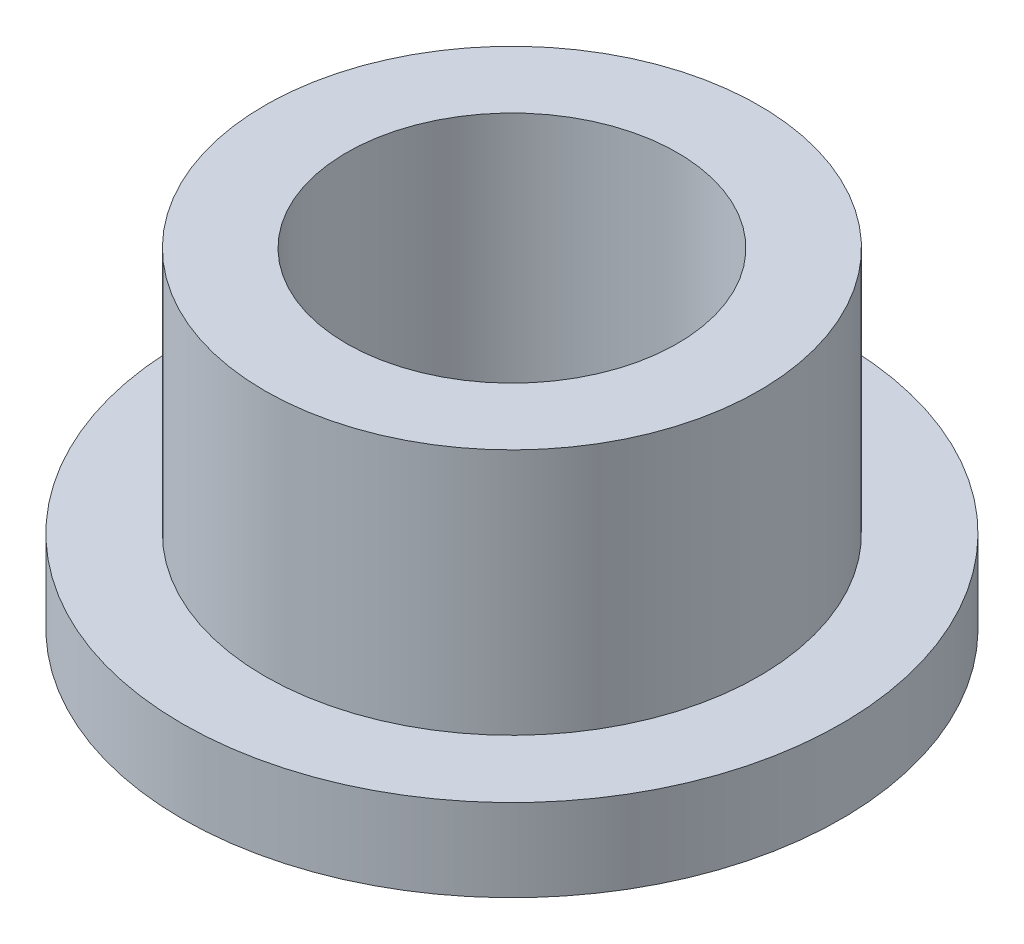
ISO-10303-21;
HEADER;
FILE_DESCRIPTION(('STEP AP214'),'2;1');
FILE_NAME('part.step','',(''),(''),'','','');
FILE_SCHEMA(('AUTOMOTIVE_DESIGN { 1 0 10303 214 1 1 1 1 }'));
ENDSEC;
DATA;
#1=APPLICATION_CONTEXT('core data for automotive mechanical design processes');
#2=APPLICATION_PROTOCOL_DEFINITION('international standard','automotive_design',2000,#1);
#3=PRODUCT_CONTEXT('',#1,'mechanical');
#4=PRODUCT('Part','Part','',(#3));
#5=PRODUCT_RELATED_PRODUCT_CATEGORY('part','',(#4));
#6=PRODUCT_DEFINITION_FORMATION('','',#4);
#7=PRODUCT_DEFINITION_CONTEXT('part definition',#1,'design');
#8=PRODUCT_DEFINITION('design','',#6,#7);
#9=PRODUCT_DEFINITION_SHAPE('','',#8);
#10=(LENGTH_UNIT() NAMED_UNIT(*) SI_UNIT(.MILLI.,.METRE.));
#11=(NAMED_UNIT(*) PLANE_ANGLE_UNIT() SI_UNIT($,.RADIAN.));
#12=(NAMED_UNIT(*) SI_UNIT($,.STERADIAN.) SOLID_ANGLE_UNIT());
#13=UNCERTAINTY_MEASURE_WITH_UNIT(LENGTH_MEASURE(1.E-05),#10,'distance_accuracy_value','');
#14=(GEOMETRIC_REPRESENTATION_CONTEXT(3) GLOBAL_UNCERTAINTY_ASSIGNED_CONTEXT((#13)) GLOBAL_UNIT_ASSIGNED_CONTEXT((#10,
#11,#12)) REPRESENTATION_CONTEXT('',''));
#15=CARTESIAN_POINT('',(0.,0.,0.));
#16=DIRECTION('',(0.,0.,1.));
#17=DIRECTION('',(1.,0.,0.));
#18=AXIS2_PLACEMENT_3D('',#15,#16,#17);
#19=CARTESIAN_POINT('',(0.,12.7,0.));
#20=DIRECTION('',(0.,1.,0.));
#21=DIRECTION('',(0.,0.,1.));
#22=AXIS2_PLACEMENT_3D('',#19,#20,#21);
#23=PLANE('',#22);
#24=CARTESIAN_POINT('',(0.,12.7,0.));
#25=DIRECTION('',(0.,1.,0.));
#26=DIRECTION('',(0.,0.,1.));
#27=AXIS2_PLACEMENT_3D('',#24,#25,#26);
#28=CIRCLE('',#27,9.525);
#29=CARTESIAN_POINT('',(0.,12.7,9.525));
#30=VERTEX_POINT('',#29);
#31=EDGE_CURVE('E10',#30,#30,#28,.T.);
#32=ORIENTED_EDGE('',*,*,#31,.T.);
#33=EDGE_LOOP('',(#32));
#34=FACE_BOUND('',#33,.T.);
#35=CARTESIAN_POINT('',(0.,12.7,0.));
#36=DIRECTION('',(0.,1.,0.));
#37=DIRECTION('',(0.,0.,1.));
#38=AXIS2_PLACEMENT_3D('',#35,#36,#37);
#39=CIRCLE('',#38,6.3754);
#40=CARTESIAN_POINT('',(0.,12.7,6.3754));
#41=VERTEX_POINT('',#40);
#42=EDGE_CURVE('E39',#41,#41,#39,.T.);
#43=ORIENTED_EDGE('',*,*,#42,.F.);
#44=EDGE_LOOP('',(#43));
#45=FACE_BOUND('',#44,.T.);
#46=ADVANCED_FACE('F32',(#34,#45),#23,.T.);
#47=CARTESIAN_POINT('',(0.,0.,0.));
#48=DIRECTION('',(0.,1.,0.));
#49=DIRECTION('',(0.,0.,1.));
#50=AXIS2_PLACEMENT_3D('',#47,#48,#49);
#51=PLANE('',#50);
#52=CARTESIAN_POINT('',(0.,0.,0.));
#53=DIRECTION('',(0.,1.,0.));
#54=DIRECTION('',(0.,0.,1.));
#55=AXIS2_PLACEMENT_3D('',#52,#53,#54);
#56=CIRCLE('',#55,6.3754);
#57=CARTESIAN_POINT('',(0.,0.,6.3754));
#58=VERTEX_POINT('',#57);
#59=EDGE_CURVE('E43',#58,#58,#56,.T.);
#60=ORIENTED_EDGE('',*,*,#59,.T.);
#61=EDGE_LOOP('',(#60));
#62=FACE_BOUND('',#61,.T.);
#63=CARTESIAN_POINT('',(0.,0.,0.));
#64=DIRECTION('',(0.,1.,0.));
#65=DIRECTION('',(0.,0.,1.));
#66=AXIS2_PLACEMENT_3D('',#63,#64,#65);
#67=CIRCLE('',#66,12.7);
#68=CARTESIAN_POINT('',(0.,0.,12.7));
#69=VERTEX_POINT('',#68);
#70=EDGE_CURVE('E50',#69,#69,#67,.T.);
#71=ORIENTED_EDGE('',*,*,#70,.F.);
#72=EDGE_LOOP('',(#71));
#73=FACE_BOUND('',#72,.T.);
#74=ADVANCED_FACE('F75',(#62,#73),#51,.F.);
#75=CARTESIAN_POINT('',(0.,12.7,0.));
#76=DIRECTION('',(0.,-1.,0.));
#77=DIRECTION('',(0.,0.,-1.));
#78=AXIS2_PLACEMENT_3D('',#75,#76,#77);
#79=CYLINDRICAL_SURFACE('',#78,9.525);
#80=CARTESIAN_POINT('',(0.,3.175,0.));
#81=DIRECTION('',(0.,1.,0.));
#82=DIRECTION('',(0.,0.,1.));
#83=AXIS2_PLACEMENT_3D('',#80,#81,#82);
#84=CIRCLE('',#83,9.525);
#85=CARTESIAN_POINT('',(0.,3.175,9.525));
#86=VERTEX_POINT('',#85);
#87=EDGE_CURVE('E53',#86,#86,#84,.T.);
#88=ORIENTED_EDGE('',*,*,#87,.T.);
#89=EDGE_LOOP('',(#88));
#90=FACE_BOUND('',#89,.T.);
#91=ORIENTED_EDGE('',*,*,#31,.F.);
#92=EDGE_LOOP('',(#91));
#93=FACE_BOUND('',#92,.T.);
#94=ADVANCED_FACE('F34',(#90,#93),#79,.T.);
#95=CARTESIAN_POINT('',(0.,12.7,0.));
#96=DIRECTION('',(0.,-1.,0.));
#97=DIRECTION('',(0.,0.,-1.));
#98=AXIS2_PLACEMENT_3D('',#95,#96,#97);
#99=CYLINDRICAL_SURFACE('',#98,6.3754);
#100=ORIENTED_EDGE('',*,*,#42,.T.);
#101=EDGE_LOOP('',(#100));
#102=FACE_BOUND('',#101,.T.);
#103=ORIENTED_EDGE('',*,*,#59,.F.);
#104=EDGE_LOOP('',(#103));
#105=FACE_BOUND('',#104,.T.);
#106=ADVANCED_FACE('F64',(#102,#105),#99,.F.);
#107=CARTESIAN_POINT('',(0.,3.175,0.));
#108=DIRECTION('',(0.,1.,0.));
#109=DIRECTION('',(0.,0.,1.));
#110=AXIS2_PLACEMENT_3D('',#107,#108,#109);
#111=PLANE('',#110);
#112=CARTESIAN_POINT('',(0.,3.175,0.));
#113=DIRECTION('',(0.,1.,0.));
#114=DIRECTION('',(0.,0.,1.));
#115=AXIS2_PLACEMENT_3D('',#112,#113,#114);
#116=CIRCLE('',#115,12.7);
#117=CARTESIAN_POINT('',(0.,3.175,12.7));
#118=VERTEX_POINT('',#117);
#119=EDGE_CURVE('E48',#118,#118,#116,.T.);
#120=ORIENTED_EDGE('',*,*,#119,.T.);
#121=EDGE_LOOP('',(#120));
#122=FACE_BOUND('',#121,.T.);
#123=ORIENTED_EDGE('',*,*,#87,.F.);
#124=EDGE_LOOP('',(#123));
#125=FACE_BOUND('',#124,.T.);
#126=ADVANCED_FACE('F61',(#122,#125),#111,.T.);
#127=CARTESIAN_POINT('',(0.,3.175,0.));
#128=DIRECTION('',(0.,-1.,0.));
#129=DIRECTION('',(0.,0.,-1.));
#130=AXIS2_PLACEMENT_3D('',#127,#128,#129);
#131=CYLINDRICAL_SURFACE('',#130,12.7);
#132=ORIENTED_EDGE('',*,*,#119,.F.);
#133=EDGE_LOOP('',(#132));
#134=FACE_BOUND('',#133,.T.);
#135=ORIENTED_EDGE('',*,*,#70,.T.);
#136=EDGE_LOOP('',(#135));
#137=FACE_BOUND('',#136,.T.);
#138=ADVANCED_FACE('F63',(#134,#137),#131,.T.);
#139=CLOSED_SHELL('',(#46,#74,#94,#106,#126,#138));
#140=MANIFOLD_SOLID_BREP('B2',#139);
#141=ADVANCED_BREP_SHAPE_REPRESENTATION('',(#18,#140),#14);
#142=SHAPE_DEFINITION_REPRESENTATION(#9,#141);
ENDSEC;
END-ISO-10303-21;
